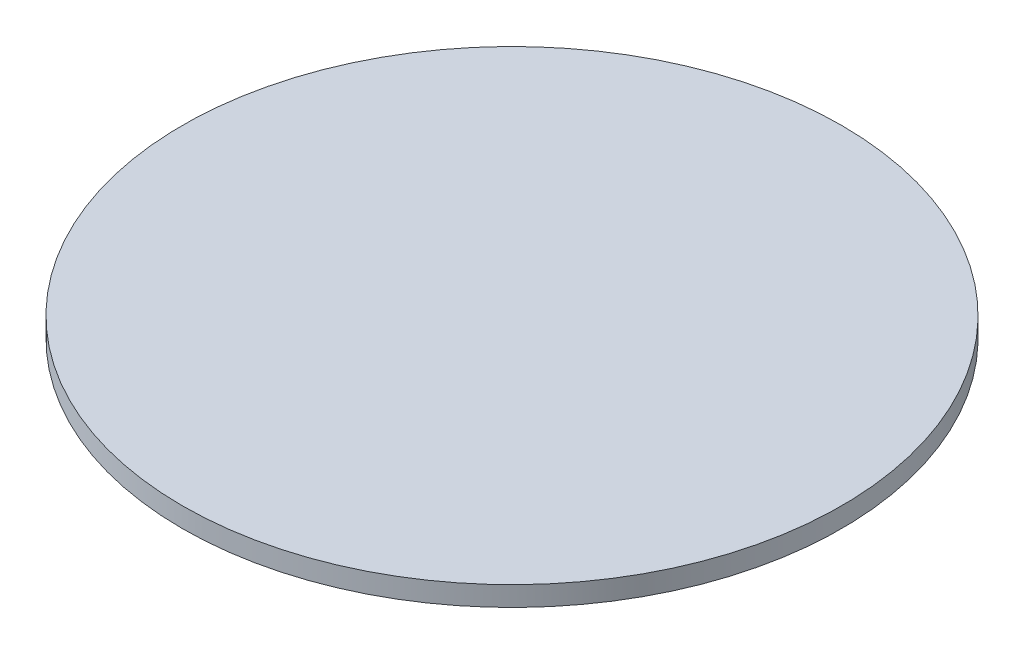
ISO-10303-21;
HEADER;
FILE_DESCRIPTION(('STEP AP214'),'2;1');
FILE_NAME('part.step','',(''),(''),'','','');
FILE_SCHEMA(('AUTOMOTIVE_DESIGN { 1 0 10303 214 1 1 1 1 }'));
ENDSEC;
DATA;
#1=APPLICATION_CONTEXT('core data for automotive mechanical design processes');
#2=APPLICATION_PROTOCOL_DEFINITION('international standard','automotive_design',2000,#1);
#3=PRODUCT_CONTEXT('',#1,'mechanical');
#4=PRODUCT('Part','Part','',(#3));
#5=PRODUCT_RELATED_PRODUCT_CATEGORY('part','',(#4));
#6=PRODUCT_DEFINITION_FORMATION('','',#4);
#7=PRODUCT_DEFINITION_CONTEXT('part definition',#1,'design');
#8=PRODUCT_DEFINITION('design','',#6,#7);
#9=PRODUCT_DEFINITION_SHAPE('','',#8);
#10=(LENGTH_UNIT() NAMED_UNIT(*) SI_UNIT(.MILLI.,.METRE.));
#11=(NAMED_UNIT(*) PLANE_ANGLE_UNIT() SI_UNIT($,.RADIAN.));
#12=(NAMED_UNIT(*) SI_UNIT($,.STERADIAN.) SOLID_ANGLE_UNIT());
#13=UNCERTAINTY_MEASURE_WITH_UNIT(LENGTH_MEASURE(1.E-05),#10,'distance_accuracy_value','');
#14=(GEOMETRIC_REPRESENTATION_CONTEXT(3) GLOBAL_UNCERTAINTY_ASSIGNED_CONTEXT((#13)) GLOBAL_UNIT_ASSIGNED_CONTEXT((#10,
#11,#12)) REPRESENTATION_CONTEXT('',''));
#15=CARTESIAN_POINT('',(0.,0.,0.));
#16=DIRECTION('',(0.,0.,1.));
#17=DIRECTION('',(1.,0.,0.));
#18=AXIS2_PLACEMENT_3D('',#15,#16,#17);
#19=CARTESIAN_POINT('',(0.,3.,0.));
#20=DIRECTION('',(0.,-1.,0.));
#21=DIRECTION('',(0.,0.,-1.));
#22=AXIS2_PLACEMENT_3D('',#19,#20,#21);
#23=CYLINDRICAL_SURFACE('',#22,50.);
#24=CARTESIAN_POINT('',(0.,3.,0.));
#25=DIRECTION('',(0.,1.,0.));
#26=DIRECTION('',(0.,0.,1.));
#27=AXIS2_PLACEMENT_3D('',#24,#25,#26);
#28=CIRCLE('',#27,50.);
#29=CARTESIAN_POINT('',(0.,3.,50.));
#30=VERTEX_POINT('',#29);
#31=EDGE_CURVE('E10',#30,#30,#28,.T.);
#32=ORIENTED_EDGE('',*,*,#31,.F.);
#33=EDGE_LOOP('',(#32));
#34=FACE_BOUND('',#33,.T.);
#35=CARTESIAN_POINT('',(0.,0.,0.));
#36=DIRECTION('',(0.,1.,0.));
#37=DIRECTION('',(0.,0.,1.));
#38=AXIS2_PLACEMENT_3D('',#35,#36,#37);
#39=CIRCLE('',#38,50.);
#40=CARTESIAN_POINT('',(0.,0.,50.));
#41=VERTEX_POINT('',#40);
#42=EDGE_CURVE('E33',#41,#41,#39,.T.);
#43=ORIENTED_EDGE('',*,*,#42,.T.);
#44=EDGE_LOOP('',(#43));
#45=FACE_BOUND('',#44,.T.);
#46=ADVANCED_FACE('F30',(#34,#45),#23,.T.);
#47=CARTESIAN_POINT('',(0.,3.,0.));
#48=DIRECTION('',(0.,1.,0.));
#49=DIRECTION('',(0.,0.,1.));
#50=AXIS2_PLACEMENT_3D('',#47,#48,#49);
#51=PLANE('',#50);
#52=ORIENTED_EDGE('',*,*,#31,.T.);
#53=EDGE_LOOP('',(#52));
#54=FACE_BOUND('',#53,.T.);
#55=ADVANCED_FACE('F45',(#54),#51,.T.);
#56=CARTESIAN_POINT('',(0.,0.,0.));
#57=DIRECTION('',(0.,1.,0.));
#58=DIRECTION('',(0.,0.,1.));
#59=AXIS2_PLACEMENT_3D('',#56,#57,#58);
#60=PLANE('',#59);
#61=ORIENTED_EDGE('',*,*,#42,.F.);
#62=EDGE_LOOP('',(#61));
#63=FACE_BOUND('',#62,.T.);
#64=ADVANCED_FACE('F43',(#63),#60,.F.);
#65=CLOSED_SHELL('',(#46,#55,#64));
#66=MANIFOLD_SOLID_BREP('B2',#65);
#67=ADVANCED_BREP_SHAPE_REPRESENTATION('',(#18,#66),#14);
#68=SHAPE_DEFINITION_REPRESENTATION(#9,#67);
ENDSEC;
END-ISO-10303-21;
